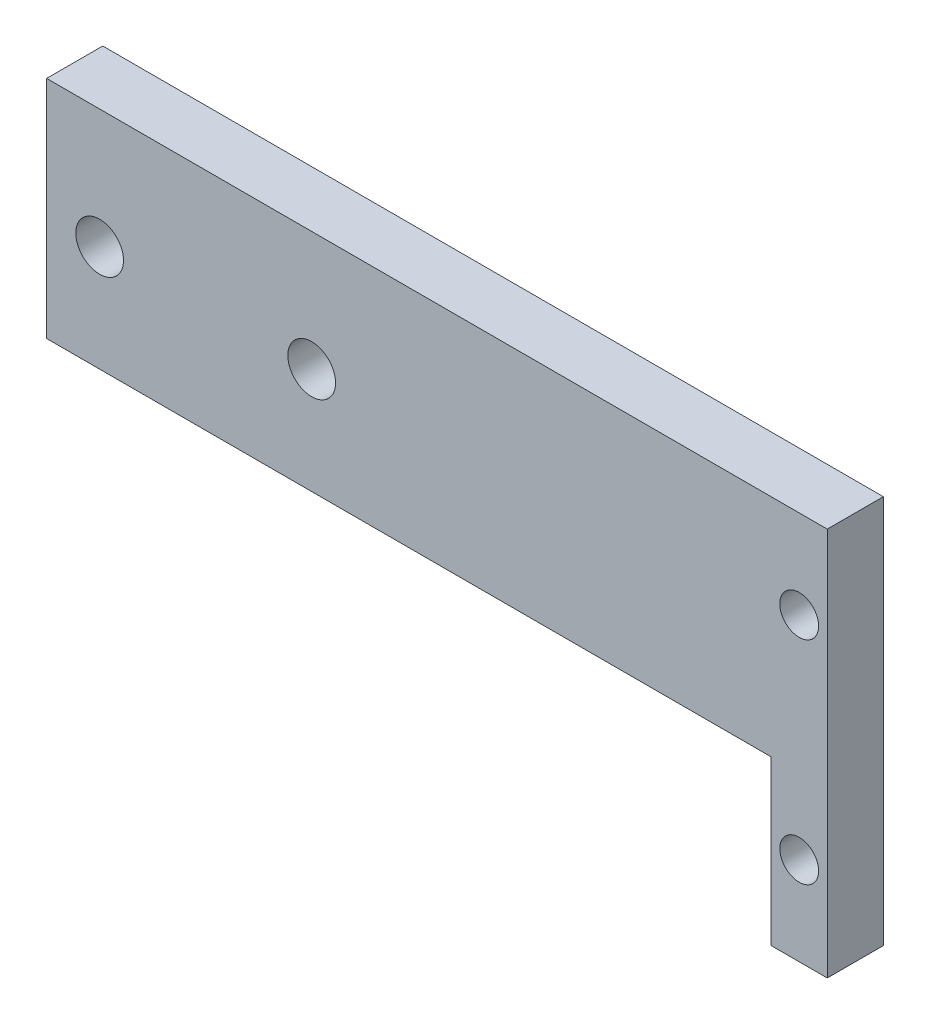
ISO-10303-21;
HEADER;
FILE_DESCRIPTION(('STEP AP214'),'2;1');
FILE_NAME('part.step','',(''),(''),'','','');
FILE_SCHEMA(('AUTOMOTIVE_DESIGN { 1 0 10303 214 1 1 1 1 }'));
ENDSEC;
DATA;
#1=APPLICATION_CONTEXT('core data for automotive mechanical design processes');
#2=APPLICATION_PROTOCOL_DEFINITION('international standard','automotive_design',2000,#1);
#3=PRODUCT_CONTEXT('',#1,'mechanical');
#4=PRODUCT('Part','Part','',(#3));
#5=PRODUCT_RELATED_PRODUCT_CATEGORY('part','',(#4));
#6=PRODUCT_DEFINITION_FORMATION('','',#4);
#7=PRODUCT_DEFINITION_CONTEXT('part definition',#1,'design');
#8=PRODUCT_DEFINITION('design','',#6,#7);
#9=PRODUCT_DEFINITION_SHAPE('','',#8);
#10=(LENGTH_UNIT() NAMED_UNIT(*) SI_UNIT(.MILLI.,.METRE.));
#11=(NAMED_UNIT(*) PLANE_ANGLE_UNIT() SI_UNIT($,.RADIAN.));
#12=(NAMED_UNIT(*) SI_UNIT($,.STERADIAN.) SOLID_ANGLE_UNIT());
#13=UNCERTAINTY_MEASURE_WITH_UNIT(LENGTH_MEASURE(1.E-05),#10,'distance_accuracy_value','');
#14=(GEOMETRIC_REPRESENTATION_CONTEXT(3) GLOBAL_UNCERTAINTY_ASSIGNED_CONTEXT((#13)) GLOBAL_UNIT_ASSIGNED_CONTEXT((#10,
#11,#12)) REPRESENTATION_CONTEXT('',''));
#15=CARTESIAN_POINT('',(0.,0.,0.));
#16=DIRECTION('',(0.,0.,1.));
#17=DIRECTION('',(1.,0.,0.));
#18=AXIS2_PLACEMENT_3D('',#15,#16,#17);
#19=CARTESIAN_POINT('',(3.175,0.,3.175));
#20=DIRECTION('',(0.,1.,0.));
#21=DIRECTION('',(-1.,0.,0.));
#22=AXIS2_PLACEMENT_3D('',#19,#20,#21);
#23=PLANE('',#22);
#24=DIRECTION('',(1.,0.,0.));
#25=VECTOR('',#24,1.);
#26=CARTESIAN_POINT('',(3.175,0.,0.));
#27=LINE('',#26,#25);
#28=CARTESIAN_POINT('',(0.,0.,0.));
#29=VERTEX_POINT('',#28);
#30=CARTESIAN_POINT('',(3.175,0.,0.));
#31=VERTEX_POINT('',#30);
#32=EDGE_CURVE('E117',#29,#31,#27,.T.);
#33=ORIENTED_EDGE('',*,*,#32,.T.);
#34=DIRECTION('',(0.,0.,-1.));
#35=VECTOR('',#34,1.);
#36=CARTESIAN_POINT('',(3.175,0.,3.175));
#37=LINE('',#36,#35);
#38=CARTESIAN_POINT('',(3.175,0.,3.175));
#39=VERTEX_POINT('',#38);
#40=EDGE_CURVE('E11',#39,#31,#37,.T.);
#41=ORIENTED_EDGE('',*,*,#40,.F.);
#42=DIRECTION('',(1.,0.,0.));
#43=VECTOR('',#42,1.);
#44=CARTESIAN_POINT('',(3.175,0.,3.175));
#45=LINE('',#44,#43);
#46=CARTESIAN_POINT('',(0.,0.,3.175));
#47=VERTEX_POINT('',#46);
#48=EDGE_CURVE('E128',#47,#39,#45,.T.);
#49=ORIENTED_EDGE('',*,*,#48,.F.);
#50=DIRECTION('',(0.,0.,-1.));
#51=VECTOR('',#50,1.);
#52=CARTESIAN_POINT('',(0.,0.,3.175));
#53=LINE('',#52,#51);
#54=EDGE_CURVE('E113',#47,#29,#53,.T.);
#55=ORIENTED_EDGE('',*,*,#54,.T.);
#56=EDGE_LOOP('',(#33,#41,#49,#55));
#57=FACE_BOUND('',#56,.T.);
#58=ADVANCED_FACE('F33',(#57),#23,.F.);
#59=CARTESIAN_POINT('',(3.175,22.,3.175));
#60=DIRECTION('',(-1.,0.,0.));
#61=DIRECTION('',(0.,-1.,0.));
#62=AXIS2_PLACEMENT_3D('',#59,#60,#61);
#63=PLANE('',#62);
#64=DIRECTION('',(0.,1.,0.));
#65=VECTOR('',#64,1.);
#66=CARTESIAN_POINT('',(3.175,22.,0.));
#67=LINE('',#66,#65);
#68=CARTESIAN_POINT('',(3.175,22.,0.));
#69=VERTEX_POINT('',#68);
#70=EDGE_CURVE('E120',#31,#69,#67,.T.);
#71=ORIENTED_EDGE('',*,*,#70,.T.);
#72=DIRECTION('',(0.,0.,-1.));
#73=VECTOR('',#72,1.);
#74=CARTESIAN_POINT('',(3.175,22.,3.175));
#75=LINE('',#74,#73);
#76=CARTESIAN_POINT('',(3.175,22.,3.175));
#77=VERTEX_POINT('',#76);
#78=EDGE_CURVE('E41',#77,#69,#75,.T.);
#79=ORIENTED_EDGE('',*,*,#78,.F.);
#80=DIRECTION('',(0.,1.,0.));
#81=VECTOR('',#80,1.);
#82=CARTESIAN_POINT('',(3.175,22.,3.175));
#83=LINE('',#82,#81);
#84=EDGE_CURVE('E86',#39,#77,#83,.T.);
#85=ORIENTED_EDGE('',*,*,#84,.F.);
#86=ORIENTED_EDGE('',*,*,#40,.T.);
#87=EDGE_LOOP('',(#71,#79,#85,#86));
#88=FACE_BOUND('',#87,.T.);
#89=ADVANCED_FACE('F153',(#88),#63,.F.);
#90=CARTESIAN_POINT('',(-41.,22.,3.175));
#91=DIRECTION('',(0.,-1.,0.));
#92=DIRECTION('',(0.,0.,-1.));
#93=AXIS2_PLACEMENT_3D('',#90,#91,#92);
#94=PLANE('',#93);
#95=DIRECTION('',(-1.,0.,0.));
#96=VECTOR('',#95,1.);
#97=CARTESIAN_POINT('',(-41.,22.,0.));
#98=LINE('',#97,#96);
#99=CARTESIAN_POINT('',(-41.,22.,0.));
#100=VERTEX_POINT('',#99);
#101=EDGE_CURVE('E123',#69,#100,#98,.T.);
#102=ORIENTED_EDGE('',*,*,#101,.T.);
#103=DIRECTION('',(0.,0.,-1.));
#104=VECTOR('',#103,1.);
#105=CARTESIAN_POINT('',(-41.,22.,3.175));
#106=LINE('',#105,#104);
#107=CARTESIAN_POINT('',(-41.,22.,3.175));
#108=VERTEX_POINT('',#107);
#109=EDGE_CURVE('E108',#108,#100,#106,.T.);
#110=ORIENTED_EDGE('',*,*,#109,.F.);
#111=DIRECTION('',(-1.,0.,0.));
#112=VECTOR('',#111,1.);
#113=CARTESIAN_POINT('',(-41.,22.,3.175));
#114=LINE('',#113,#112);
#115=EDGE_CURVE('E99',#77,#108,#114,.T.);
#116=ORIENTED_EDGE('',*,*,#115,.F.);
#117=ORIENTED_EDGE('',*,*,#78,.T.);
#118=EDGE_LOOP('',(#102,#110,#116,#117));
#119=FACE_BOUND('',#118,.T.);
#120=ADVANCED_FACE('F134',(#119),#94,.F.);
#121=CARTESIAN_POINT('',(-41.,9.24999999999999,3.175));
#122=DIRECTION('',(1.,0.,0.));
#123=DIRECTION('',(0.,0.,-1.));
#124=AXIS2_PLACEMENT_3D('',#121,#122,#123);
#125=PLANE('',#124);
#126=DIRECTION('',(0.,-1.,0.));
#127=VECTOR('',#126,1.);
#128=CARTESIAN_POINT('',(-41.,9.24999999999999,0.));
#129=LINE('',#128,#127);
#130=CARTESIAN_POINT('',(-41.,9.24999999999999,0.));
#131=VERTEX_POINT('',#130);
#132=EDGE_CURVE('E107',#100,#131,#129,.T.);
#133=ORIENTED_EDGE('',*,*,#132,.T.);
#134=DIRECTION('',(0.,0.,-1.));
#135=VECTOR('',#134,1.);
#136=CARTESIAN_POINT('',(-41.,9.24999999999999,3.175));
#137=LINE('',#136,#135);
#138=CARTESIAN_POINT('',(-41.,9.24999999999999,3.175));
#139=VERTEX_POINT('',#138);
#140=EDGE_CURVE('E104',#139,#131,#137,.T.);
#141=ORIENTED_EDGE('',*,*,#140,.F.);
#142=DIRECTION('',(0.,-1.,0.));
#143=VECTOR('',#142,1.);
#144=CARTESIAN_POINT('',(-41.,9.24999999999999,3.175));
#145=LINE('',#144,#143);
#146=EDGE_CURVE('E93',#108,#139,#145,.T.);
#147=ORIENTED_EDGE('',*,*,#146,.F.);
#148=ORIENTED_EDGE('',*,*,#109,.T.);
#149=EDGE_LOOP('',(#133,#141,#147,#148));
#150=FACE_BOUND('',#149,.T.);
#151=ADVANCED_FACE('F105',(#150),#125,.F.);
#152=CARTESIAN_POINT('',(0.,9.24999999999999,3.175));
#153=DIRECTION('',(0.,1.,0.));
#154=DIRECTION('',(-1.,0.,0.));
#155=AXIS2_PLACEMENT_3D('',#152,#153,#154);
#156=PLANE('',#155);
#157=DIRECTION('',(1.,0.,0.));
#158=VECTOR('',#157,1.);
#159=CARTESIAN_POINT('',(0.,9.24999999999999,0.));
#160=LINE('',#159,#158);
#161=CARTESIAN_POINT('',(0.,9.24999999999999,0.));
#162=VERTEX_POINT('',#161);
#163=EDGE_CURVE('E72',#131,#162,#160,.T.);
#164=ORIENTED_EDGE('',*,*,#163,.T.);
#165=DIRECTION('',(0.,0.,-1.));
#166=VECTOR('',#165,1.);
#167=CARTESIAN_POINT('',(0.,9.24999999999999,3.175));
#168=LINE('',#167,#166);
#169=CARTESIAN_POINT('',(0.,9.24999999999999,3.175));
#170=VERTEX_POINT('',#169);
#171=EDGE_CURVE('E109',#170,#162,#168,.T.);
#172=ORIENTED_EDGE('',*,*,#171,.F.);
#173=DIRECTION('',(1.,0.,0.));
#174=VECTOR('',#173,1.);
#175=CARTESIAN_POINT('',(0.,9.24999999999999,3.175));
#176=LINE('',#175,#174);
#177=EDGE_CURVE('E97',#139,#170,#176,.T.);
#178=ORIENTED_EDGE('',*,*,#177,.F.);
#179=ORIENTED_EDGE('',*,*,#140,.T.);
#180=EDGE_LOOP('',(#164,#172,#178,#179));
#181=FACE_BOUND('',#180,.T.);
#182=ADVANCED_FACE('F111',(#181),#156,.F.);
#183=CARTESIAN_POINT('',(0.,0.,3.175));
#184=DIRECTION('',(1.,0.,0.));
#185=DIRECTION('',(0.,0.,-1.));
#186=AXIS2_PLACEMENT_3D('',#183,#184,#185);
#187=PLANE('',#186);
#188=DIRECTION('',(0.,-1.,0.));
#189=VECTOR('',#188,1.);
#190=CARTESIAN_POINT('',(0.,0.,0.));
#191=LINE('',#190,#189);
#192=EDGE_CURVE('E78',#162,#29,#191,.T.);
#193=ORIENTED_EDGE('',*,*,#192,.T.);
#194=ORIENTED_EDGE('',*,*,#54,.F.);
#195=DIRECTION('',(0.,-1.,0.));
#196=VECTOR('',#195,1.);
#197=CARTESIAN_POINT('',(0.,0.,3.175));
#198=LINE('',#197,#196);
#199=EDGE_CURVE('E49',#170,#47,#198,.T.);
#200=ORIENTED_EDGE('',*,*,#199,.F.);
#201=ORIENTED_EDGE('',*,*,#171,.T.);
#202=EDGE_LOOP('',(#193,#194,#200,#201));
#203=FACE_BOUND('',#202,.T.);
#204=ADVANCED_FACE('F141',(#203),#187,.F.);
#205=CARTESIAN_POINT('',(0.,0.,3.175));
#206=DIRECTION('',(0.,0.,-1.));
#207=DIRECTION('',(-1.,0.,0.));
#208=AXIS2_PLACEMENT_3D('',#205,#206,#207);
#209=PLANE('',#208);
#210=CARTESIAN_POINT('',(1.5875,17.,3.175));
#211=DIRECTION('',(0.,0.,1.));
#212=DIRECTION('',(1.,0.,0.));
#213=AXIS2_PLACEMENT_3D('',#210,#211,#212);
#214=CIRCLE('',#213,1.1);
#215=CARTESIAN_POINT('',(2.6875,17.,3.175));
#216=VERTEX_POINT('',#215);
#217=EDGE_CURVE('E239',#216,#216,#214,.T.);
#218=ORIENTED_EDGE('',*,*,#217,.F.);
#219=EDGE_LOOP('',(#218));
#220=FACE_BOUND('',#219,.T.);
#221=CARTESIAN_POINT('',(1.5875,5.,3.175));
#222=DIRECTION('',(0.,0.,1.));
#223=DIRECTION('',(1.,0.,0.));
#224=AXIS2_PLACEMENT_3D('',#221,#222,#223);
#225=CIRCLE('',#224,1.1);
#226=CARTESIAN_POINT('',(2.6875,5.,3.175));
#227=VERTEX_POINT('',#226);
#228=EDGE_CURVE('E241',#227,#227,#225,.T.);
#229=ORIENTED_EDGE('',*,*,#228,.F.);
#230=EDGE_LOOP('',(#229));
#231=FACE_BOUND('',#230,.T.);
#232=CARTESIAN_POINT('',(-38.,15.25,3.175));
#233=DIRECTION('',(0.,0.,1.));
#234=DIRECTION('',(1.,0.,0.));
#235=AXIS2_PLACEMENT_3D('',#232,#233,#234);
#236=CIRCLE('',#235,1.35);
#237=CARTESIAN_POINT('',(-36.65,15.25,3.175));
#238=VERTEX_POINT('',#237);
#239=EDGE_CURVE('E249',#238,#238,#236,.T.);
#240=ORIENTED_EDGE('',*,*,#239,.F.);
#241=EDGE_LOOP('',(#240));
#242=FACE_BOUND('',#241,.T.);
#243=CARTESIAN_POINT('',(-26.,15.25,3.175));
#244=DIRECTION('',(0.,0.,1.));
#245=DIRECTION('',(1.,0.,0.));
#246=AXIS2_PLACEMENT_3D('',#243,#244,#245);
#247=CIRCLE('',#246,1.35);
#248=CARTESIAN_POINT('',(-24.65,15.25,3.175));
#249=VERTEX_POINT('',#248);
#250=EDGE_CURVE('E255',#249,#249,#247,.T.);
#251=ORIENTED_EDGE('',*,*,#250,.F.);
#252=EDGE_LOOP('',(#251));
#253=FACE_BOUND('',#252,.T.);
#254=ORIENTED_EDGE('',*,*,#48,.T.);
#255=ORIENTED_EDGE('',*,*,#84,.T.);
#256=ORIENTED_EDGE('',*,*,#115,.T.);
#257=ORIENTED_EDGE('',*,*,#146,.T.);
#258=ORIENTED_EDGE('',*,*,#177,.T.);
#259=ORIENTED_EDGE('',*,*,#199,.T.);
#260=EDGE_LOOP('',(#254,#255,#256,#257,#258,#259));
#261=FACE_BOUND('',#260,.T.);
#262=ADVANCED_FACE('F95',(#220,#231,#242,#253,#261),#209,.F.);
#263=CARTESIAN_POINT('',(0.,0.,0.));
#264=DIRECTION('',(0.,0.,-1.));
#265=DIRECTION('',(-1.,0.,0.));
#266=AXIS2_PLACEMENT_3D('',#263,#264,#265);
#267=PLANE('',#266);
#268=CARTESIAN_POINT('',(1.5875,17.,0.));
#269=DIRECTION('',(0.,0.,1.));
#270=DIRECTION('',(1.,0.,0.));
#271=AXIS2_PLACEMENT_3D('',#268,#269,#270);
#272=CIRCLE('',#271,1.1);
#273=CARTESIAN_POINT('',(2.6875,17.,0.));
#274=VERTEX_POINT('',#273);
#275=EDGE_CURVE('E236',#274,#274,#272,.T.);
#276=ORIENTED_EDGE('',*,*,#275,.T.);
#277=EDGE_LOOP('',(#276));
#278=FACE_BOUND('',#277,.T.);
#279=CARTESIAN_POINT('',(1.5875,5.,0.));
#280=DIRECTION('',(0.,0.,1.));
#281=DIRECTION('',(1.,0.,0.));
#282=AXIS2_PLACEMENT_3D('',#279,#280,#281);
#283=CIRCLE('',#282,1.1);
#284=CARTESIAN_POINT('',(2.6875,5.,0.));
#285=VERTEX_POINT('',#284);
#286=EDGE_CURVE('E246',#285,#285,#283,.T.);
#287=ORIENTED_EDGE('',*,*,#286,.T.);
#288=EDGE_LOOP('',(#287));
#289=FACE_BOUND('',#288,.T.);
#290=CARTESIAN_POINT('',(-38.,15.25,0.));
#291=DIRECTION('',(0.,0.,1.));
#292=DIRECTION('',(1.,0.,0.));
#293=AXIS2_PLACEMENT_3D('',#290,#291,#292);
#294=CIRCLE('',#293,1.35);
#295=CARTESIAN_POINT('',(-36.65,15.25,0.));
#296=VERTEX_POINT('',#295);
#297=EDGE_CURVE('E252',#296,#296,#294,.T.);
#298=ORIENTED_EDGE('',*,*,#297,.T.);
#299=EDGE_LOOP('',(#298));
#300=FACE_BOUND('',#299,.T.);
#301=CARTESIAN_POINT('',(-26.,15.25,0.));
#302=DIRECTION('',(0.,0.,1.));
#303=DIRECTION('',(1.,0.,0.));
#304=AXIS2_PLACEMENT_3D('',#301,#302,#303);
#305=CIRCLE('',#304,1.35);
#306=CARTESIAN_POINT('',(-24.65,15.25,0.));
#307=VERTEX_POINT('',#306);
#308=EDGE_CURVE('E121',#307,#307,#305,.T.);
#309=ORIENTED_EDGE('',*,*,#308,.T.);
#310=EDGE_LOOP('',(#309));
#311=FACE_BOUND('',#310,.T.);
#312=ORIENTED_EDGE('',*,*,#32,.F.);
#313=ORIENTED_EDGE('',*,*,#192,.F.);
#314=ORIENTED_EDGE('',*,*,#163,.F.);
#315=ORIENTED_EDGE('',*,*,#132,.F.);
#316=ORIENTED_EDGE('',*,*,#101,.F.);
#317=ORIENTED_EDGE('',*,*,#70,.F.);
#318=EDGE_LOOP('',(#312,#313,#314,#315,#316,#317));
#319=FACE_BOUND('',#318,.T.);
#320=ADVANCED_FACE('F137',(#278,#289,#300,#311,#319),#267,.T.);
#321=CARTESIAN_POINT('',(-26.,15.25,3.175));
#322=DIRECTION('',(0.,0.,1.));
#323=DIRECTION('',(1.,0.,0.));
#324=AXIS2_PLACEMENT_3D('',#321,#322,#323);
#325=CYLINDRICAL_SURFACE('',#324,1.35);
#326=ORIENTED_EDGE('',*,*,#308,.F.);
#327=EDGE_LOOP('',(#326));
#328=FACE_BOUND('',#327,.T.);
#329=ORIENTED_EDGE('',*,*,#250,.T.);
#330=EDGE_LOOP('',(#329));
#331=FACE_BOUND('',#330,.T.);
#332=ADVANCED_FACE('F181',(#328,#331),#325,.F.);
#333=CARTESIAN_POINT('',(-38.,15.25,3.175));
#334=DIRECTION('',(0.,0.,1.));
#335=DIRECTION('',(1.,0.,0.));
#336=AXIS2_PLACEMENT_3D('',#333,#334,#335);
#337=CYLINDRICAL_SURFACE('',#336,1.35);
#338=ORIENTED_EDGE('',*,*,#297,.F.);
#339=EDGE_LOOP('',(#338));
#340=FACE_BOUND('',#339,.T.);
#341=ORIENTED_EDGE('',*,*,#239,.T.);
#342=EDGE_LOOP('',(#341));
#343=FACE_BOUND('',#342,.T.);
#344=ADVANCED_FACE('F186',(#340,#343),#337,.F.);
#345=CARTESIAN_POINT('',(1.5875,5.,3.175));
#346=DIRECTION('',(0.,0.,1.));
#347=DIRECTION('',(1.,0.,0.));
#348=AXIS2_PLACEMENT_3D('',#345,#346,#347);
#349=CYLINDRICAL_SURFACE('',#348,1.1);
#350=ORIENTED_EDGE('',*,*,#286,.F.);
#351=EDGE_LOOP('',(#350));
#352=FACE_BOUND('',#351,.T.);
#353=ORIENTED_EDGE('',*,*,#228,.T.);
#354=EDGE_LOOP('',(#353));
#355=FACE_BOUND('',#354,.T.);
#356=ADVANCED_FACE('F198',(#352,#355),#349,.F.);
#357=CARTESIAN_POINT('',(1.5875,17.,3.175));
#358=DIRECTION('',(0.,0.,1.));
#359=DIRECTION('',(1.,0.,0.));
#360=AXIS2_PLACEMENT_3D('',#357,#358,#359);
#361=CYLINDRICAL_SURFACE('',#360,1.1);
#362=ORIENTED_EDGE('',*,*,#275,.F.);
#363=EDGE_LOOP('',(#362));
#364=FACE_BOUND('',#363,.T.);
#365=ORIENTED_EDGE('',*,*,#217,.T.);
#366=EDGE_LOOP('',(#365));
#367=FACE_BOUND('',#366,.T.);
#368=ADVANCED_FACE('F219',(#364,#367),#361,.F.);
#369=CLOSED_SHELL('',(#58,#89,#120,#151,#182,#204,#262,#320,#332,#344,#356,#368));
#370=MANIFOLD_SOLID_BREP('B2',#369);
#371=ADVANCED_BREP_SHAPE_REPRESENTATION('',(#18,#370),#14);
#372=SHAPE_DEFINITION_REPRESENTATION(#9,#371);
ENDSEC;
END-ISO-10303-21;
